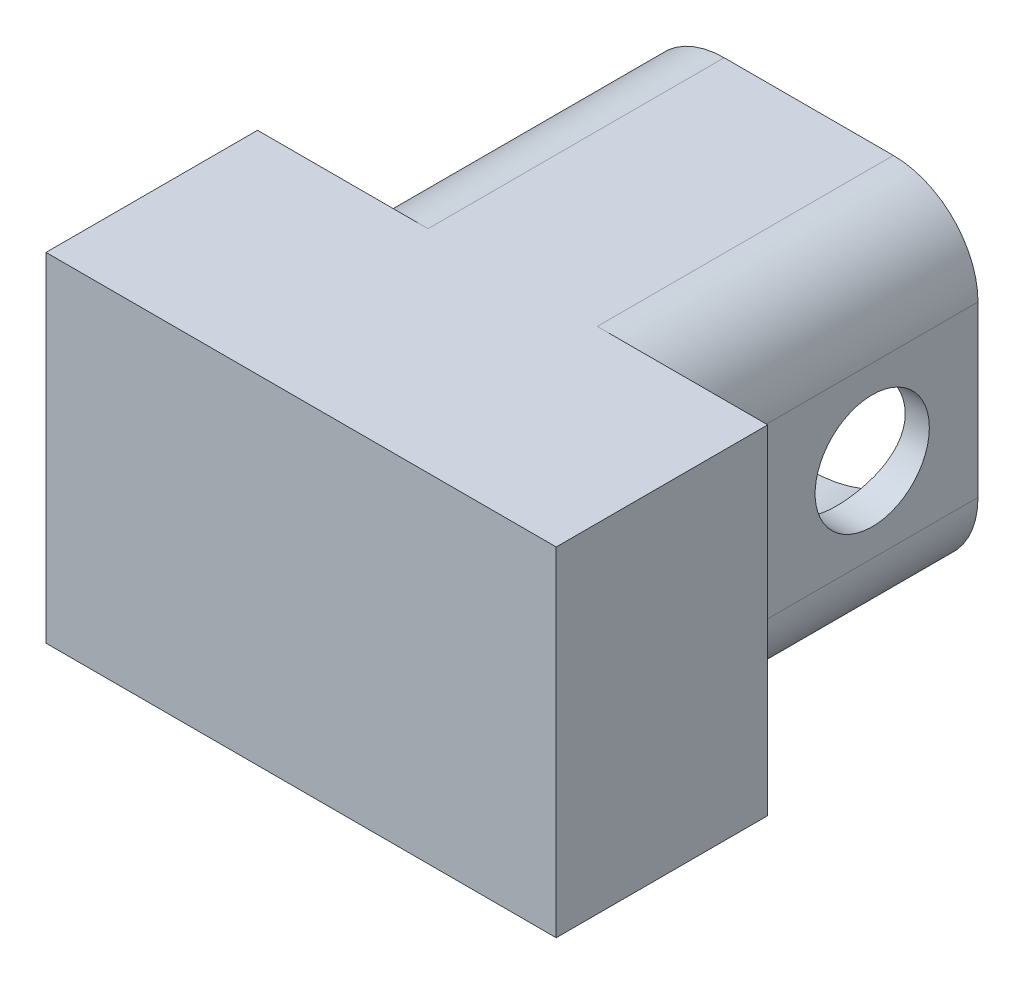
ISO-10303-21;
HEADER;
FILE_DESCRIPTION(('STEP AP214'),'2;1');
FILE_NAME('part.step','',(''),(''),'','','');
FILE_SCHEMA(('AUTOMOTIVE_DESIGN { 1 0 10303 214 1 1 1 1 }'));
ENDSEC;
DATA;
#1=APPLICATION_CONTEXT('core data for automotive mechanical design processes');
#2=APPLICATION_PROTOCOL_DEFINITION('international standard','automotive_design',2000,#1);
#3=PRODUCT_CONTEXT('',#1,'mechanical');
#4=PRODUCT('Part','Part','',(#3));
#5=PRODUCT_RELATED_PRODUCT_CATEGORY('part','',(#4));
#6=PRODUCT_DEFINITION_FORMATION('','',#4);
#7=PRODUCT_DEFINITION_CONTEXT('part definition',#1,'design');
#8=PRODUCT_DEFINITION('design','',#6,#7);
#9=PRODUCT_DEFINITION_SHAPE('','',#8);
#10=(LENGTH_UNIT() NAMED_UNIT(*) SI_UNIT(.MILLI.,.METRE.));
#11=(NAMED_UNIT(*) PLANE_ANGLE_UNIT() SI_UNIT($,.RADIAN.));
#12=(NAMED_UNIT(*) SI_UNIT($,.STERADIAN.) SOLID_ANGLE_UNIT());
#13=UNCERTAINTY_MEASURE_WITH_UNIT(LENGTH_MEASURE(1.E-05),#10,'distance_accuracy_value','');
#14=(GEOMETRIC_REPRESENTATION_CONTEXT(3) GLOBAL_UNCERTAINTY_ASSIGNED_CONTEXT((#13)) GLOBAL_UNIT_ASSIGNED_CONTEXT((#10,
#11,#12)) REPRESENTATION_CONTEXT('',''));
#15=CARTESIAN_POINT('',(0.,0.,0.));
#16=DIRECTION('',(0.,0.,1.));
#17=DIRECTION('',(1.,0.,0.));
#18=AXIS2_PLACEMENT_3D('',#15,#16,#17);
#19=CARTESIAN_POINT('',(0.,0.,0.));
#20=DIRECTION('',(0.,0.,1.));
#21=DIRECTION('',(1.,0.,0.));
#22=AXIS2_PLACEMENT_3D('',#19,#20,#21);
#23=PLANE('',#22);
#24=DIRECTION('',(-1.,0.,0.));
#25=VECTOR('',#24,1.);
#26=CARTESIAN_POINT('',(4.,-4.,0.));
#27=LINE('',#26,#25);
#28=CARTESIAN_POINT('',(2.,-4.,0.));
#29=VERTEX_POINT('',#28);
#30=CARTESIAN_POINT('',(-2.,-4.,0.));
#31=VERTEX_POINT('',#30);
#32=EDGE_CURVE('E207',#29,#31,#27,.T.);
#33=ORIENTED_EDGE('',*,*,#32,.T.);
#34=CARTESIAN_POINT('',(-2.,-2.,0.));
#35=DIRECTION('',(0.,0.,1.));
#36=DIRECTION('',(1.,0.,0.));
#37=AXIS2_PLACEMENT_3D('',#34,#35,#36);
#38=CIRCLE('',#37,2.);
#39=CARTESIAN_POINT('',(-4.,-2.,0.));
#40=VERTEX_POINT('',#39);
#41=EDGE_CURVE('E229',#31,#40,#38,.F.);
#42=ORIENTED_EDGE('',*,*,#41,.T.);
#43=DIRECTION('',(0.,1.,0.));
#44=VECTOR('',#43,1.);
#45=CARTESIAN_POINT('',(-4.,-4.,0.));
#46=LINE('',#45,#44);
#47=CARTESIAN_POINT('',(-4.,2.,0.));
#48=VERTEX_POINT('',#47);
#49=EDGE_CURVE('E313',#40,#48,#46,.T.);
#50=ORIENTED_EDGE('',*,*,#49,.T.);
#51=CARTESIAN_POINT('',(-2.,2.,0.));
#52=DIRECTION('',(0.,0.,1.));
#53=DIRECTION('',(1.,0.,0.));
#54=AXIS2_PLACEMENT_3D('',#51,#52,#53);
#55=CIRCLE('',#54,2.);
#56=CARTESIAN_POINT('',(-2.,4.,0.));
#57=VERTEX_POINT('',#56);
#58=EDGE_CURVE('E240',#48,#57,#55,.F.);
#59=ORIENTED_EDGE('',*,*,#58,.T.);
#60=DIRECTION('',(-1.,0.,0.));
#61=VECTOR('',#60,1.);
#62=CARTESIAN_POINT('',(4.,4.,0.));
#63=LINE('',#62,#61);
#64=CARTESIAN_POINT('',(2.,4.,0.));
#65=VERTEX_POINT('',#64);
#66=EDGE_CURVE('E354',#65,#57,#63,.T.);
#67=ORIENTED_EDGE('',*,*,#66,.F.);
#68=CARTESIAN_POINT('',(2.,2.,0.));
#69=DIRECTION('',(0.,0.,1.));
#70=DIRECTION('',(1.,0.,0.));
#71=AXIS2_PLACEMENT_3D('',#68,#69,#70);
#72=CIRCLE('',#71,2.);
#73=CARTESIAN_POINT('',(4.,2.,0.));
#74=VERTEX_POINT('',#73);
#75=EDGE_CURVE('E182',#65,#74,#72,.F.);
#76=ORIENTED_EDGE('',*,*,#75,.T.);
#77=DIRECTION('',(0.,1.,0.));
#78=VECTOR('',#77,1.);
#79=CARTESIAN_POINT('',(4.,-4.,0.));
#80=LINE('',#79,#78);
#81=CARTESIAN_POINT('',(4.,-2.,0.));
#82=VERTEX_POINT('',#81);
#83=EDGE_CURVE('E223',#82,#74,#80,.T.);
#84=ORIENTED_EDGE('',*,*,#83,.F.);
#85=CARTESIAN_POINT('',(2.,-2.,0.));
#86=DIRECTION('',(0.,0.,1.));
#87=DIRECTION('',(1.,0.,0.));
#88=AXIS2_PLACEMENT_3D('',#85,#86,#87);
#89=CIRCLE('',#88,2.);
#90=EDGE_CURVE('E210',#82,#29,#89,.F.);
#91=ORIENTED_EDGE('',*,*,#90,.T.);
#92=EDGE_LOOP('',(#33,#42,#50,#59,#67,#76,#84,#91));
#93=FACE_BOUND('',#92,.T.);
#94=CARTESIAN_POINT('',(0.,0.,0.));
#95=DIRECTION('',(0.,0.,1.));
#96=DIRECTION('',(1.,0.,0.));
#97=AXIS2_PLACEMENT_3D('',#94,#95,#96);
#98=CIRCLE('',#97,3.43);
#99=CARTESIAN_POINT('',(3.43,0.,0.));
#100=VERTEX_POINT('',#99);
#101=EDGE_CURVE('E219',#100,#100,#98,.T.);
#102=ORIENTED_EDGE('',*,*,#101,.T.);
#103=EDGE_LOOP('',(#102));
#104=FACE_BOUND('',#103,.T.);
#105=ADVANCED_FACE('F34',(#93,#104),#23,.F.);
#106=CARTESIAN_POINT('',(4.,-4.,7.));
#107=DIRECTION('',(-1.,0.,0.));
#108=DIRECTION('',(0.,0.,1.));
#109=AXIS2_PLACEMENT_3D('',#106,#107,#108);
#110=PLANE('',#109);
#111=CARTESIAN_POINT('',(4.,0.,2.5));
#112=DIRECTION('',(1.,0.,0.));
#113=DIRECTION('',(0.,0.,-1.));
#114=AXIS2_PLACEMENT_3D('',#111,#112,#113);
#115=CIRCLE('',#114,1.35);
#116=CARTESIAN_POINT('',(4.,0.,1.15));
#117=VERTEX_POINT('',#116);
#118=EDGE_CURVE('E147',#117,#117,#115,.T.);
#119=ORIENTED_EDGE('',*,*,#118,.F.);
#120=EDGE_LOOP('',(#119));
#121=FACE_BOUND('',#120,.T.);
#122=DIRECTION('',(0.,1.,0.));
#123=VECTOR('',#122,1.);
#124=CARTESIAN_POINT('',(4.,-4.,7.));
#125=LINE('',#124,#123);
#126=CARTESIAN_POINT('',(4.,-2.,7.));
#127=VERTEX_POINT('',#126);
#128=CARTESIAN_POINT('',(4.,2.,7.));
#129=VERTEX_POINT('',#128);
#130=EDGE_CURVE('E176',#127,#129,#125,.T.);
#131=ORIENTED_EDGE('',*,*,#130,.F.);
#132=DIRECTION('',(0.,0.,-1.));
#133=VECTOR('',#132,1.);
#134=CARTESIAN_POINT('',(4.,-2.,0.));
#135=LINE('',#134,#133);
#136=EDGE_CURVE('E190',#127,#82,#135,.T.);
#137=ORIENTED_EDGE('',*,*,#136,.T.);
#138=ORIENTED_EDGE('',*,*,#83,.T.);
#139=DIRECTION('',(0.,0.,-1.));
#140=VECTOR('',#139,1.);
#141=CARTESIAN_POINT('',(4.,2.,7.));
#142=LINE('',#141,#140);
#143=EDGE_CURVE('E205',#74,#129,#142,.F.);
#144=ORIENTED_EDGE('',*,*,#143,.T.);
#145=EDGE_LOOP('',(#131,#137,#138,#144));
#146=FACE_BOUND('',#145,.T.);
#147=ADVANCED_FACE('F202',(#121,#146),#110,.F.);
#148=CARTESIAN_POINT('',(4.,4.,7.));
#149=DIRECTION('',(0.,-1.,0.));
#150=DIRECTION('',(1.,0.,0.));
#151=AXIS2_PLACEMENT_3D('',#148,#149,#150);
#152=PLANE('',#151);
#153=DIRECTION('',(-1.,0.,0.));
#154=VECTOR('',#153,1.);
#155=CARTESIAN_POINT('',(6.03,4.,7.));
#156=LINE('',#155,#154);
#157=CARTESIAN_POINT('',(6.03,4.,7.));
#158=VERTEX_POINT('',#157);
#159=CARTESIAN_POINT('',(2.,4.,7.));
#160=VERTEX_POINT('',#159);
#161=EDGE_CURVE('E49',#158,#160,#156,.T.);
#162=ORIENTED_EDGE('',*,*,#161,.T.);
#163=DIRECTION('',(0.,0.,-1.));
#164=VECTOR('',#163,1.);
#165=CARTESIAN_POINT('',(2.,4.,7.));
#166=LINE('',#165,#164);
#167=EDGE_CURVE('E180',#160,#65,#166,.T.);
#168=ORIENTED_EDGE('',*,*,#167,.T.);
#169=ORIENTED_EDGE('',*,*,#66,.T.);
#170=DIRECTION('',(0.,0.,-1.));
#171=VECTOR('',#170,1.);
#172=CARTESIAN_POINT('',(-2.,4.,7.));
#173=LINE('',#172,#171);
#174=CARTESIAN_POINT('',(-2.,4.,7.));
#175=VERTEX_POINT('',#174);
#176=EDGE_CURVE('E186',#57,#175,#173,.F.);
#177=ORIENTED_EDGE('',*,*,#176,.T.);
#178=CARTESIAN_POINT('',(-6.03,4.,7.));
#179=VERTEX_POINT('',#178);
#180=EDGE_CURVE('E56',#175,#179,#156,.T.);
#181=ORIENTED_EDGE('',*,*,#180,.T.);
#182=DIRECTION('',(0.,0.,-1.));
#183=VECTOR('',#182,1.);
#184=CARTESIAN_POINT('',(-6.03,4.,12.));
#185=LINE('',#184,#183);
#186=CARTESIAN_POINT('',(-6.03,4.,12.));
#187=VERTEX_POINT('',#186);
#188=EDGE_CURVE('E164',#187,#179,#185,.T.);
#189=ORIENTED_EDGE('',*,*,#188,.F.);
#190=DIRECTION('',(-1.,0.,0.));
#191=VECTOR('',#190,1.);
#192=CARTESIAN_POINT('',(6.03,4.,12.));
#193=LINE('',#192,#191);
#194=CARTESIAN_POINT('',(6.03,4.,12.));
#195=VERTEX_POINT('',#194);
#196=EDGE_CURVE('E140',#195,#187,#193,.T.);
#197=ORIENTED_EDGE('',*,*,#196,.F.);
#198=DIRECTION('',(0.,0.,-1.));
#199=VECTOR('',#198,1.);
#200=CARTESIAN_POINT('',(6.03,4.,12.));
#201=LINE('',#200,#199);
#202=EDGE_CURVE('E152',#195,#158,#201,.T.);
#203=ORIENTED_EDGE('',*,*,#202,.T.);
#204=EDGE_LOOP('',(#162,#168,#169,#177,#181,#189,#197,#203));
#205=FACE_BOUND('',#204,.T.);
#206=ADVANCED_FACE('F167',(#205),#152,.F.);
#207=CARTESIAN_POINT('',(-4.,-4.,7.));
#208=DIRECTION('',(-1.,0.,0.));
#209=DIRECTION('',(0.,0.,1.));
#210=AXIS2_PLACEMENT_3D('',#207,#208,#209);
#211=PLANE('',#210);
#212=CARTESIAN_POINT('',(-4.,0.,2.5));
#213=DIRECTION('',(-1.,0.,0.));
#214=DIRECTION('',(0.,0.,1.));
#215=AXIS2_PLACEMENT_3D('',#212,#213,#214);
#216=CIRCLE('',#215,1.35);
#217=CARTESIAN_POINT('',(-4.,0.,3.85));
#218=VERTEX_POINT('',#217);
#219=EDGE_CURVE('E255',#218,#218,#216,.T.);
#220=ORIENTED_EDGE('',*,*,#219,.F.);
#221=EDGE_LOOP('',(#220));
#222=FACE_BOUND('',#221,.T.);
#223=ORIENTED_EDGE('',*,*,#49,.F.);
#224=DIRECTION('',(0.,0.,-1.));
#225=VECTOR('',#224,1.);
#226=CARTESIAN_POINT('',(-4.,-2.,7.));
#227=LINE('',#226,#225);
#228=CARTESIAN_POINT('',(-4.,-2.,7.));
#229=VERTEX_POINT('',#228);
#230=EDGE_CURVE('E211',#40,#229,#227,.F.);
#231=ORIENTED_EDGE('',*,*,#230,.T.);
#232=DIRECTION('',(0.,1.,0.));
#233=VECTOR('',#232,1.);
#234=CARTESIAN_POINT('',(-4.,-4.,7.));
#235=LINE('',#234,#233);
#236=CARTESIAN_POINT('',(-4.,2.,7.));
#237=VERTEX_POINT('',#236);
#238=EDGE_CURVE('E206',#229,#237,#235,.T.);
#239=ORIENTED_EDGE('',*,*,#238,.T.);
#240=DIRECTION('',(0.,0.,-1.));
#241=VECTOR('',#240,1.);
#242=CARTESIAN_POINT('',(-4.,2.,0.));
#243=LINE('',#242,#241);
#244=EDGE_CURVE('E231',#237,#48,#243,.T.);
#245=ORIENTED_EDGE('',*,*,#244,.T.);
#246=EDGE_LOOP('',(#223,#231,#239,#245));
#247=FACE_BOUND('',#246,.T.);
#248=ADVANCED_FACE('F289',(#222,#247),#211,.T.);
#249=CARTESIAN_POINT('',(4.,-4.,7.));
#250=DIRECTION('',(0.,-1.,0.));
#251=DIRECTION('',(1.,0.,0.));
#252=AXIS2_PLACEMENT_3D('',#249,#250,#251);
#253=PLANE('',#252);
#254=DIRECTION('',(1.,0.,0.));
#255=VECTOR('',#254,1.);
#256=CARTESIAN_POINT('',(6.03,-4.,7.));
#257=LINE('',#256,#255);
#258=CARTESIAN_POINT('',(-6.03,-4.,7.));
#259=VERTEX_POINT('',#258);
#260=CARTESIAN_POINT('',(-2.,-4.,7.));
#261=VERTEX_POINT('',#260);
#262=EDGE_CURVE('E315',#259,#261,#257,.T.);
#263=ORIENTED_EDGE('',*,*,#262,.T.);
#264=DIRECTION('',(0.,0.,-1.));
#265=VECTOR('',#264,1.);
#266=CARTESIAN_POINT('',(-2.,-4.,7.));
#267=LINE('',#266,#265);
#268=EDGE_CURVE('E244',#261,#31,#267,.T.);
#269=ORIENTED_EDGE('',*,*,#268,.T.);
#270=ORIENTED_EDGE('',*,*,#32,.F.);
#271=DIRECTION('',(0.,0.,-1.));
#272=VECTOR('',#271,1.);
#273=CARTESIAN_POINT('',(2.,-4.,7.));
#274=LINE('',#273,#272);
#275=CARTESIAN_POINT('',(2.,-4.,7.));
#276=VERTEX_POINT('',#275);
#277=EDGE_CURVE('E228',#29,#276,#274,.F.);
#278=ORIENTED_EDGE('',*,*,#277,.T.);
#279=CARTESIAN_POINT('',(6.03,-4.,7.));
#280=VERTEX_POINT('',#279);
#281=EDGE_CURVE('E195',#276,#280,#257,.T.);
#282=ORIENTED_EDGE('',*,*,#281,.T.);
#283=DIRECTION('',(0.,0.,-1.));
#284=VECTOR('',#283,1.);
#285=CARTESIAN_POINT('',(6.03,-4.,12.));
#286=LINE('',#285,#284);
#287=CARTESIAN_POINT('',(6.03,-4.,12.));
#288=VERTEX_POINT('',#287);
#289=EDGE_CURVE('E131',#288,#280,#286,.T.);
#290=ORIENTED_EDGE('',*,*,#289,.F.);
#291=DIRECTION('',(1.,0.,0.));
#292=VECTOR('',#291,1.);
#293=CARTESIAN_POINT('',(6.03,-4.,12.));
#294=LINE('',#293,#292);
#295=CARTESIAN_POINT('',(-6.03,-4.,12.));
#296=VERTEX_POINT('',#295);
#297=EDGE_CURVE('E124',#296,#288,#294,.T.);
#298=ORIENTED_EDGE('',*,*,#297,.F.);
#299=DIRECTION('',(0.,0.,-1.));
#300=VECTOR('',#299,1.);
#301=CARTESIAN_POINT('',(-6.03,-4.,12.));
#302=LINE('',#301,#300);
#303=EDGE_CURVE('E128',#296,#259,#302,.T.);
#304=ORIENTED_EDGE('',*,*,#303,.T.);
#305=EDGE_LOOP('',(#263,#269,#270,#278,#282,#290,#298,#304));
#306=FACE_BOUND('',#305,.T.);
#307=ADVANCED_FACE('F126',(#306),#253,.T.);
#308=CARTESIAN_POINT('',(0.,0.,6.));
#309=DIRECTION('',(0.,0.,-1.));
#310=DIRECTION('',(-1.,0.,0.));
#311=AXIS2_PLACEMENT_3D('',#308,#309,#310);
#312=CYLINDRICAL_SURFACE('',#311,3.43);
#313=CARTESIAN_POINT('',(-3.43,0.,3.85));
#314=CARTESIAN_POINT('',(-3.42999461867466,-0.0726691182774942,3.84999259309495));
#315=CARTESIAN_POINT('',(-3.42766400164212,-0.145447312396492,3.84409905425139));
#316=CARTESIAN_POINT('',(-3.41856831393283,-0.288952529132376,3.82072680978598));
#317=CARTESIAN_POINT('',(-3.41179191570856,-0.359673828931423,3.80321850926845));
#318=CARTESIAN_POINT('',(-3.39453674778715,-0.496766583296369,3.75734976535437));
#319=CARTESIAN_POINT('',(-3.38406967210994,-0.563151000929101,3.72902357546589));
#320=CARTESIAN_POINT('',(-3.36046765154247,-0.690171098961408,3.66245791337116));
#321=CARTESIAN_POINT('',(-3.34733352245565,-0.750808528961646,3.62422147154585));
#322=CARTESIAN_POINT('',(-3.31905714947214,-0.867474998141879,3.53706686520674));
#323=CARTESIAN_POINT('',(-3.30385392699048,-0.923205587481664,3.48776911274514));
#324=CARTESIAN_POINT('',(-3.27343650157305,-1.02585845035394,3.3806926554875));
#325=CARTESIAN_POINT('',(-3.25822229680117,-1.07277666646124,3.32291006578114));
#326=CARTESIAN_POINT('',(-3.2287830922689,-1.15844834318152,3.1974993611374));
#327=CARTESIAN_POINT('',(-3.21462826714246,-1.19676658276798,3.12955577745696));
#328=CARTESIAN_POINT('',(-3.18986369608175,-1.26129824313533,2.98754641920018));
#329=CARTESIAN_POINT('',(-3.17925233249198,-1.28751718956027,2.91348345754891));
#330=CARTESIAN_POINT('',(-3.16342921281114,-1.32590800852618,2.76476497524941));
#331=CARTESIAN_POINT('',(-3.15799929319833,-1.33865014836824,2.69028070902979));
#332=CARTESIAN_POINT('',(-3.15251982669444,-1.35150754824921,2.54004856151097));
#333=CARTESIAN_POINT('',(-3.15246774545233,-1.35162875600753,2.46430129224554));
#334=CARTESIAN_POINT('',(-3.15756319203003,-1.33967405873048,2.31910261939723));
#335=CARTESIAN_POINT('',(-3.16236258809315,-1.3284147967796,2.24956941617616));
#336=CARTESIAN_POINT('',(-3.1760374186897,-1.29537737604351,2.11347325833907));
#337=CARTESIAN_POINT('',(-3.18491353988524,-1.27359744518022,2.04691080617379));
#338=CARTESIAN_POINT('',(-3.20593399859639,-1.21972721450417,1.91707076796523));
#339=CARTESIAN_POINT('',(-3.21814028228068,-1.18743899062582,1.85388577447715));
#340=CARTESIAN_POINT('',(-3.24442774907871,-1.11360738829165,1.73360384860275));
#341=CARTESIAN_POINT('',(-3.25850962123978,-1.07206060466362,1.67650916760388));
#342=CARTESIAN_POINT('',(-3.28824214724732,-0.977244971484314,1.56554487631282));
#343=CARTESIAN_POINT('',(-3.30393144751812,-0.923332695973701,1.5122339681562));
#344=CARTESIAN_POINT('',(-3.33421492974229,-0.807162225398411,1.41523440908283));
#345=CARTESIAN_POINT('',(-3.34880890687259,-0.744902475409229,1.3715475549022));
#346=CARTESIAN_POINT('',(-3.37560234922155,-0.612261684597452,1.29433434560813));
#347=CARTESIAN_POINT('',(-3.38775229002867,-0.541751250595059,1.26101183913964));
#348=CARTESIAN_POINT('',(-3.40791621167952,-0.395526524995113,1.20689211637504));
#349=CARTESIAN_POINT('',(-3.4159322240217,-0.319814810184563,1.18608874707395));
#350=CARTESIAN_POINT('',(-3.42655830686419,-0.170024854204709,1.15871307697103));
#351=CARTESIAN_POINT('',(-3.42945336553016,-0.0961040364780771,1.15138955621822));
#352=CARTESIAN_POINT('',(-3.43040459655297,0.0519594736526745,1.14897134582755));
#353=CARTESIAN_POINT('',(-3.42846197428817,0.126102106190727,1.15387360995849));
#354=CARTESIAN_POINT('',(-3.42014313177614,0.269141358817323,1.17521036248535));
#355=CARTESIAN_POINT('',(-3.41396207117091,0.338126237988831,1.19113750269105));
#356=CARTESIAN_POINT('',(-3.39798859243504,0.472384809445665,1.23338742607333));
#357=CARTESIAN_POINT('',(-3.38819570832586,0.537658021616487,1.2597115506454));
#358=CARTESIAN_POINT('',(-3.36558403842615,0.664865596422934,1.32286388322368));
#359=CARTESIAN_POINT('',(-3.35268248230786,0.726638636466474,1.35998647633805));
#360=CARTESIAN_POINT('',(-3.32525982786698,0.843293370557398,1.44335390129011));
#361=CARTESIAN_POINT('',(-3.31073809339974,0.898172339618932,1.48960232179718));
#362=CARTESIAN_POINT('',(-3.28050972685944,1.00315978517192,1.59337996861441));
#363=CARTESIAN_POINT('',(-3.26478670516577,1.05273881757062,1.65144143654552));
#364=CARTESIAN_POINT('',(-3.23479747245334,1.14157326617891,1.77534704584264));
#365=CARTESIAN_POINT('',(-3.22053147030175,1.18082720352902,1.84119230012197));
#366=CARTESIAN_POINT('',(-3.19507292578562,1.24808622152813,1.97966398501648));
#367=CARTESIAN_POINT('',(-3.18390628842723,1.27599734489246,2.05234115095503));
#368=CARTESIAN_POINT('',(-3.16634614139655,1.31897742617913,2.20193373176816));
#369=CARTESIAN_POINT('',(-3.15994926356162,1.33405544725479,2.27884611465514));
#370=CARTESIAN_POINT('',(-3.15312990950876,1.35008910988525,2.42892526676529));
#371=CARTESIAN_POINT('',(-3.15232060651769,1.35195934905278,2.5019774089218));
#372=CARTESIAN_POINT('',(-3.15576023996586,1.34391083221688,2.64730074137794));
#373=CARTESIAN_POINT('',(-3.16000858149335,1.33399346274586,2.71957202251839));
#374=CARTESIAN_POINT('',(-3.17274849766893,1.30338946943694,2.85854398466298));
#375=CARTESIAN_POINT('',(-3.18107697665835,1.28311559172533,2.92535185188826));
#376=CARTESIAN_POINT('',(-3.20092890531337,1.2327542225459,3.05464767833826));
#377=CARTESIAN_POINT('',(-3.21245319821345,1.20266414064418,3.11713449198326));
#378=CARTESIAN_POINT('',(-3.2382007811331,1.13157385286638,3.23982829071314));
#379=CARTESIAN_POINT('',(-3.25253913812091,1.09005670350219,3.2997112293429));
#380=CARTESIAN_POINT('',(-3.28193778010447,0.998055219571338,3.41195129544823));
#381=CARTESIAN_POINT('',(-3.29699831560464,0.947567756772763,3.46430578595444));
#382=CARTESIAN_POINT('',(-3.32726679350281,0.835329731057404,3.56332747262566));
#383=CARTESIAN_POINT('',(-3.34242588135929,0.773074636116301,3.60944009043098));
#384=CARTESIAN_POINT('',(-3.37021708000253,0.641147577831644,3.69055458956778));
#385=CARTESIAN_POINT('',(-3.38284885347425,0.571474626342043,3.72555498814139));
#386=CARTESIAN_POINT('',(-3.4032459880961,0.43279331961214,3.78073483741147));
#387=CARTESIAN_POINT('',(-3.41133365710132,0.364231562222375,3.8019209538476));
#388=CARTESIAN_POINT('',(-3.42336679150098,0.224385414752733,3.83313695462557));
#389=CARTESIAN_POINT('',(-3.42732364250881,0.153109072571589,3.84319750849202));
#390=CARTESIAN_POINT('',(-3.42967818481395,0.0543912841734435,3.84918069940821));
#391=CARTESIAN_POINT('',(-3.43000201446954,0.0272032846930257,3.85000277273416));
#392=CARTESIAN_POINT('',(-3.43,0.,3.85));
#393=B_SPLINE_CURVE_WITH_KNOTS('',3,(#313,#314,#315,#316,#317,#318,#319,#320,#321,#322,#323,
#324,#325,#326,#327,#328,#329,#330,#331,#332,#333,#334,#335,#336,#337,#338,#339,#340,#341,#342,
#343,#344,#345,#346,#347,#348,#349,#350,#351,#352,#353,#354,#355,#356,#357,#358,#359,#360,#361,
#362,#363,#364,#365,#366,#367,#368,#369,#370,#371,#372,#373,#374,#375,#376,#377,#378,#379,#380,
#381,#382,#383,#384,#385,#386,#387,#388,#389,#390,#391,#392),.UNSPECIFIED.,.T.,.F.,(4,2,2,2,2,2,
2,2,2,2,2,2,2,2,2,2,2,2,2,2,2,2,2,2,2,2,2,2,2,2,2,2,2,2,2,2,2,2,2,4),(0.,0.217926796673844,
0.436411023739172,0.654209107595914,0.871940671036631,1.09877051041955,1.32570453297856,
1.56234803073253,1.79888334820339,2.02495152166391,2.25091315813152,2.46173572429921,
2.67259381334025,2.88767864081601,3.10284270450285,3.33406480050383,3.56533002736004,
3.80089187076459,4.03633784360556,4.2582115635739,4.48003000601818,4.69226575629962,
4.90452889770864,5.12323026745045,5.34201781202764,5.57479566805454,5.80760684663349,
6.04230900790883,6.27684527703592,6.49496569924976,6.71306046731138,6.92307232834853,
7.13313965507331,7.35498019959905,7.57689825932702,7.8125882716601,8.04830972006175,
8.26400114104489,8.47909647779845,8.56067617537397),.UNSPECIFIED.);
#394=CARTESIAN_POINT('',(-3.43,0.,3.85));
#395=VERTEX_POINT('',#394);
#396=EDGE_CURVE('E248',#395,#395,#393,.T.);
#397=ORIENTED_EDGE('',*,*,#396,.F.);
#398=EDGE_LOOP('',(#397));
#399=FACE_BOUND('',#398,.T.);
#400=CARTESIAN_POINT('',(3.43,0.,1.15));
#401=CARTESIAN_POINT('',(3.42999461867466,-0.0726691182774942,1.15000740690505));
#402=CARTESIAN_POINT('',(3.42766400164212,-0.145447312396492,1.15590094574861));
#403=CARTESIAN_POINT('',(3.41856831393283,-0.288952529132376,1.17927319021402));
#404=CARTESIAN_POINT('',(3.41179191570856,-0.359673828931423,1.19678149073155));
#405=CARTESIAN_POINT('',(3.39453674778715,-0.496766583296369,1.24265023464563));
#406=CARTESIAN_POINT('',(3.38406967210994,-0.563151000929101,1.27097642453411));
#407=CARTESIAN_POINT('',(3.36046765154247,-0.690171098961408,1.33754208662884));
#408=CARTESIAN_POINT('',(3.34733352245565,-0.750808528961646,1.37577852845415));
#409=CARTESIAN_POINT('',(3.31905714947214,-0.867474998141879,1.46293313479326));
#410=CARTESIAN_POINT('',(3.30385392699048,-0.923205587481664,1.51223088725486));
#411=CARTESIAN_POINT('',(3.27343650157305,-1.02585845035394,1.6193073445125));
#412=CARTESIAN_POINT('',(3.25822229680117,-1.07277666646124,1.67708993421886));
#413=CARTESIAN_POINT('',(3.2287830922689,-1.15844834318153,1.8025006388626));
#414=CARTESIAN_POINT('',(3.21462826714246,-1.19676658276798,1.87044422254304));
#415=CARTESIAN_POINT('',(3.18986369608175,-1.26129824313533,2.01245358079982));
#416=CARTESIAN_POINT('',(3.17925233249198,-1.28751718956027,2.08651654245109));
#417=CARTESIAN_POINT('',(3.16342921281114,-1.32590800852618,2.23523502475059));
#418=CARTESIAN_POINT('',(3.15799929319833,-1.33865014836824,2.30971929097021));
#419=CARTESIAN_POINT('',(3.15251982669444,-1.35150754824921,2.45995143848903));
#420=CARTESIAN_POINT('',(3.15246774545233,-1.35162875600753,2.53569870775446));
#421=CARTESIAN_POINT('',(3.15756319203003,-1.33967405873048,2.68089738060277));
#422=CARTESIAN_POINT('',(3.16236258809315,-1.3284147967796,2.75043058382384));
#423=CARTESIAN_POINT('',(3.1760374186897,-1.29537737604351,2.88652674166093));
#424=CARTESIAN_POINT('',(3.18491353988524,-1.27359744518022,2.95308919382621));
#425=CARTESIAN_POINT('',(3.20593399859639,-1.21972721450417,3.08292923203477));
#426=CARTESIAN_POINT('',(3.21814028228068,-1.18743899062582,3.14611422552285));
#427=CARTESIAN_POINT('',(3.24442774907871,-1.11360738829165,3.26639615139725));
#428=CARTESIAN_POINT('',(3.25850962123978,-1.07206060466362,3.32349083239612));
#429=CARTESIAN_POINT('',(3.28824214724732,-0.977244971484314,3.43445512368718));
#430=CARTESIAN_POINT('',(3.30393144751812,-0.923332695973701,3.4877660318438));
#431=CARTESIAN_POINT('',(3.33421492974229,-0.807162225398411,3.58476559091717));
#432=CARTESIAN_POINT('',(3.34880890687259,-0.74490247540923,3.6284524450978));
#433=CARTESIAN_POINT('',(3.37560234922155,-0.612261684597452,3.70566565439187));
#434=CARTESIAN_POINT('',(3.38775229002867,-0.541751250595059,3.73898816086036));
#435=CARTESIAN_POINT('',(3.40791621167952,-0.395526524995113,3.79310788362496));
#436=CARTESIAN_POINT('',(3.4159322240217,-0.319814810184563,3.81391125292605));
#437=CARTESIAN_POINT('',(3.42655830686419,-0.170024854204709,3.84128692302897));
#438=CARTESIAN_POINT('',(3.42945336553016,-0.0961040364780769,3.84861044378178));
#439=CARTESIAN_POINT('',(3.43040459655297,0.0519594736526747,3.85102865417245));
#440=CARTESIAN_POINT('',(3.42846197428817,0.126102106190728,3.84612639004151));
#441=CARTESIAN_POINT('',(3.42014313177614,0.269141358817323,3.82478963751465));
#442=CARTESIAN_POINT('',(3.41396207117091,0.338126237988832,3.80886249730895));
#443=CARTESIAN_POINT('',(3.39798859243504,0.472384809445665,3.76661257392667));
#444=CARTESIAN_POINT('',(3.38819570832586,0.537658021616487,3.7402884493546));
#445=CARTESIAN_POINT('',(3.36558403842615,0.664865596422934,3.67713611677632));
#446=CARTESIAN_POINT('',(3.35268248230786,0.726638636466474,3.64001352366195));
#447=CARTESIAN_POINT('',(3.32525982786698,0.843293370557398,3.55664609870989));
#448=CARTESIAN_POINT('',(3.31073809339974,0.898172339618933,3.51039767820282));
#449=CARTESIAN_POINT('',(3.28050972685944,1.00315978517193,3.40662003138559));
#450=CARTESIAN_POINT('',(3.26478670516577,1.05273881757062,3.34855856345448));
#451=CARTESIAN_POINT('',(3.23479747245334,1.14157326617891,3.22465295415736));
#452=CARTESIAN_POINT('',(3.22053147030175,1.18082720352902,3.15880769987803));
#453=CARTESIAN_POINT('',(3.19507292578562,1.24808622152813,3.02033601498352));
#454=CARTESIAN_POINT('',(3.18390628842723,1.27599734489246,2.94765884904497));
#455=CARTESIAN_POINT('',(3.16634614139655,1.31897742617914,2.79806626823184));
#456=CARTESIAN_POINT('',(3.15994926356162,1.33405544725479,2.72115388534486));
#457=CARTESIAN_POINT('',(3.15312990950876,1.35008910988525,2.57107473323471));
#458=CARTESIAN_POINT('',(3.15232060651769,1.35195934905278,2.4980225910782));
#459=CARTESIAN_POINT('',(3.15576023996586,1.34391083221688,2.35269925862206));
#460=CARTESIAN_POINT('',(3.16000858149335,1.33399346274586,2.28042797748161));
#461=CARTESIAN_POINT('',(3.17274849766893,1.30338946943694,2.14145601533702));
#462=CARTESIAN_POINT('',(3.18107697665835,1.28311559172533,2.07464814811174));
#463=CARTESIAN_POINT('',(3.20092890531337,1.2327542225459,1.94535232166174));
#464=CARTESIAN_POINT('',(3.21245319821345,1.20266414064418,1.88286550801674));
#465=CARTESIAN_POINT('',(3.2382007811331,1.13157385286638,1.76017170928686));
#466=CARTESIAN_POINT('',(3.25253913812091,1.09005670350219,1.7002887706571));
#467=CARTESIAN_POINT('',(3.28193778010447,0.998055219571339,1.58804870455177));
#468=CARTESIAN_POINT('',(3.29699831560464,0.947567756772763,1.53569421404556));
#469=CARTESIAN_POINT('',(3.32726679350281,0.835329731057404,1.43667252737434));
#470=CARTESIAN_POINT('',(3.34242588135929,0.773074636116302,1.39055990956902));
#471=CARTESIAN_POINT('',(3.37021708000253,0.641147577831645,1.30944541043222));
#472=CARTESIAN_POINT('',(3.38284885347425,0.571474626342044,1.27444501185861));
#473=CARTESIAN_POINT('',(3.4032459880961,0.432793319612141,1.21926516258853));
#474=CARTESIAN_POINT('',(3.41133365710132,0.364231562222377,1.1980790461524));
#475=CARTESIAN_POINT('',(3.42336679150098,0.224385414752735,1.16686304537443));
#476=CARTESIAN_POINT('',(3.42732364250881,0.15310907257159,1.15680249150798));
#477=CARTESIAN_POINT('',(3.42967818481395,0.0543912841734438,1.15081930059179));
#478=CARTESIAN_POINT('',(3.43000201446954,0.0272032846930258,1.14999722726584));
#479=CARTESIAN_POINT('',(3.43,0.,1.15));
#480=B_SPLINE_CURVE_WITH_KNOTS('',3,(#400,#401,#402,#403,#404,#405,#406,#407,#408,#409,#410,
#411,#412,#413,#414,#415,#416,#417,#418,#419,#420,#421,#422,#423,#424,#425,#426,#427,#428,#429,
#430,#431,#432,#433,#434,#435,#436,#437,#438,#439,#440,#441,#442,#443,#444,#445,#446,#447,#448,
#449,#450,#451,#452,#453,#454,#455,#456,#457,#458,#459,#460,#461,#462,#463,#464,#465,#466,#467,
#468,#469,#470,#471,#472,#473,#474,#475,#476,#477,#478,#479),.UNSPECIFIED.,.T.,.F.,(4,2,2,2,2,2,
2,2,2,2,2,2,2,2,2,2,2,2,2,2,2,2,2,2,2,2,2,2,2,2,2,2,2,2,2,2,2,2,2,4),(0.,0.217926796673844,
0.436411023739172,0.654209107595914,0.871940671036631,1.09877051041955,1.32570453297856,
1.56234803073253,1.79888334820339,2.02495152166391,2.25091315813152,2.46173572429921,
2.67259381334025,2.88767864081601,3.10284270450285,3.33406480050383,3.56533002736004,
3.80089187076459,4.03633784360556,4.2582115635739,4.48003000601818,4.69226575629962,
4.90452889770864,5.12323026745045,5.34201781202764,5.57479566805454,5.80760684663349,
6.04230900790883,6.27684527703592,6.49496569924976,6.71306046731139,6.92307232834853,
7.13313965507331,7.35498019959905,7.57689825932702,7.8125882716601,8.04830972006175,
8.26400114104489,8.47909647779845,8.56067617537397),.UNSPECIFIED.);
#481=CARTESIAN_POINT('',(3.43,0.,1.15));
#482=VERTEX_POINT('',#481);
#483=EDGE_CURVE('E150',#482,#482,#480,.T.);
#484=ORIENTED_EDGE('',*,*,#483,.F.);
#485=EDGE_LOOP('',(#484));
#486=FACE_BOUND('',#485,.T.);
#487=CARTESIAN_POINT('',(0.,0.,6.));
#488=DIRECTION('',(0.,0.,1.));
#489=DIRECTION('',(1.,0.,0.));
#490=AXIS2_PLACEMENT_3D('',#487,#488,#489);
#491=CIRCLE('',#490,3.43);
#492=CARTESIAN_POINT('',(3.43,0.,6.));
#493=VERTEX_POINT('',#492);
#494=EDGE_CURVE('E350',#493,#493,#491,.T.);
#495=ORIENTED_EDGE('',*,*,#494,.T.);
#496=EDGE_LOOP('',(#495));
#497=FACE_BOUND('',#496,.T.);
#498=ORIENTED_EDGE('',*,*,#101,.F.);
#499=EDGE_LOOP('',(#498));
#500=FACE_BOUND('',#499,.T.);
#501=ADVANCED_FACE('F259',(#399,#486,#497,#500),#312,.F.);
#502=CARTESIAN_POINT('',(0.,0.,6.));
#503=DIRECTION('',(0.,0.,1.));
#504=DIRECTION('',(1.,0.,0.));
#505=AXIS2_PLACEMENT_3D('',#502,#503,#504);
#506=PLANE('',#505);
#507=ORIENTED_EDGE('',*,*,#494,.F.);
#508=EDGE_LOOP('',(#507));
#509=FACE_BOUND('',#508,.T.);
#510=ADVANCED_FACE('F268',(#509),#506,.F.);
#511=CARTESIAN_POINT('',(-8.6,0.,2.5));
#512=DIRECTION('',(1.,0.,0.));
#513=DIRECTION('',(0.,0.,-1.));
#514=AXIS2_PLACEMENT_3D('',#511,#512,#513);
#515=CYLINDRICAL_SURFACE('',#514,1.35);
#516=ORIENTED_EDGE('',*,*,#483,.T.);
#517=EDGE_LOOP('',(#516));
#518=FACE_BOUND('',#517,.T.);
#519=ORIENTED_EDGE('',*,*,#118,.T.);
#520=EDGE_LOOP('',(#519));
#521=FACE_BOUND('',#520,.T.);
#522=ADVANCED_FACE('F263',(#518,#521),#515,.F.);
#523=ORIENTED_EDGE('',*,*,#219,.T.);
#524=EDGE_LOOP('',(#523));
#525=FACE_BOUND('',#524,.T.);
#526=ORIENTED_EDGE('',*,*,#396,.T.);
#527=EDGE_LOOP('',(#526));
#528=FACE_BOUND('',#527,.T.);
#529=ADVANCED_FACE('F267',(#525,#528),#515,.F.);
#530=CARTESIAN_POINT('',(0.,0.,7.));
#531=DIRECTION('',(0.,0.,1.));
#532=DIRECTION('',(1.,0.,0.));
#533=AXIS2_PLACEMENT_3D('',#530,#531,#532);
#534=PLANE('',#533);
#535=ORIENTED_EDGE('',*,*,#281,.F.);
#536=CARTESIAN_POINT('',(2.,-2.,7.));
#537=DIRECTION('',(0.,0.,1.));
#538=DIRECTION('',(1.,0.,0.));
#539=AXIS2_PLACEMENT_3D('',#536,#537,#538);
#540=CIRCLE('',#539,2.);
#541=EDGE_CURVE('E179',#276,#127,#540,.T.);
#542=ORIENTED_EDGE('',*,*,#541,.T.);
#543=ORIENTED_EDGE('',*,*,#130,.T.);
#544=CARTESIAN_POINT('',(2.,2.,7.));
#545=DIRECTION('',(0.,0.,1.));
#546=DIRECTION('',(1.,0.,0.));
#547=AXIS2_PLACEMENT_3D('',#544,#545,#546);
#548=CIRCLE('',#547,2.);
#549=EDGE_CURVE('E42',#129,#160,#548,.T.);
#550=ORIENTED_EDGE('',*,*,#549,.T.);
#551=ORIENTED_EDGE('',*,*,#161,.F.);
#552=DIRECTION('',(0.,1.,0.));
#553=VECTOR('',#552,1.);
#554=CARTESIAN_POINT('',(6.03,-4.,7.));
#555=LINE('',#554,#553);
#556=EDGE_CURVE('E162',#280,#158,#555,.T.);
#557=ORIENTED_EDGE('',*,*,#556,.F.);
#558=EDGE_LOOP('',(#535,#542,#543,#550,#551,#557));
#559=FACE_BOUND('',#558,.T.);
#560=ADVANCED_FACE('F171',(#559),#534,.F.);
#561=CARTESIAN_POINT('',(-6.03,-4.,12.));
#562=DIRECTION('',(1.,0.,0.));
#563=DIRECTION('',(0.,0.,-1.));
#564=AXIS2_PLACEMENT_3D('',#561,#562,#563);
#565=PLANE('',#564);
#566=DIRECTION('',(0.,-1.,0.));
#567=VECTOR('',#566,1.);
#568=CARTESIAN_POINT('',(-6.03,-4.,7.));
#569=LINE('',#568,#567);
#570=EDGE_CURVE('E146',#179,#259,#569,.T.);
#571=ORIENTED_EDGE('',*,*,#570,.T.);
#572=ORIENTED_EDGE('',*,*,#303,.F.);
#573=DIRECTION('',(0.,-1.,0.));
#574=VECTOR('',#573,1.);
#575=CARTESIAN_POINT('',(-6.03,-4.,12.));
#576=LINE('',#575,#574);
#577=EDGE_CURVE('E135',#187,#296,#576,.T.);
#578=ORIENTED_EDGE('',*,*,#577,.F.);
#579=ORIENTED_EDGE('',*,*,#188,.T.);
#580=EDGE_LOOP('',(#571,#572,#578,#579));
#581=FACE_BOUND('',#580,.T.);
#582=ADVANCED_FACE('F145',(#581),#565,.F.);
#583=CARTESIAN_POINT('',(6.03,-4.,12.));
#584=DIRECTION('',(-1.,0.,0.));
#585=DIRECTION('',(0.,0.,1.));
#586=AXIS2_PLACEMENT_3D('',#583,#584,#585);
#587=PLANE('',#586);
#588=ORIENTED_EDGE('',*,*,#556,.T.);
#589=ORIENTED_EDGE('',*,*,#202,.F.);
#590=DIRECTION('',(0.,1.,0.));
#591=VECTOR('',#590,1.);
#592=CARTESIAN_POINT('',(6.03,-4.,12.));
#593=LINE('',#592,#591);
#594=EDGE_CURVE('E134',#288,#195,#593,.T.);
#595=ORIENTED_EDGE('',*,*,#594,.F.);
#596=ORIENTED_EDGE('',*,*,#289,.T.);
#597=EDGE_LOOP('',(#588,#589,#595,#596));
#598=FACE_BOUND('',#597,.T.);
#599=ADVANCED_FACE('F322',(#598),#587,.F.);
#600=CARTESIAN_POINT('',(0.,0.,12.));
#601=DIRECTION('',(0.,0.,1.));
#602=DIRECTION('',(1.,0.,0.));
#603=AXIS2_PLACEMENT_3D('',#600,#601,#602);
#604=PLANE('',#603);
#605=ORIENTED_EDGE('',*,*,#577,.T.);
#606=ORIENTED_EDGE('',*,*,#297,.T.);
#607=ORIENTED_EDGE('',*,*,#594,.T.);
#608=ORIENTED_EDGE('',*,*,#196,.T.);
#609=EDGE_LOOP('',(#605,#606,#607,#608));
#610=FACE_BOUND('',#609,.T.);
#611=ADVANCED_FACE('F138',(#610),#604,.T.);
#612=ORIENTED_EDGE('',*,*,#238,.F.);
#613=CARTESIAN_POINT('',(-2.,-2.,7.));
#614=DIRECTION('',(0.,0.,1.));
#615=DIRECTION('',(1.,0.,0.));
#616=AXIS2_PLACEMENT_3D('',#613,#614,#615);
#617=CIRCLE('',#616,2.);
#618=EDGE_CURVE('E185',#229,#261,#617,.T.);
#619=ORIENTED_EDGE('',*,*,#618,.T.);
#620=ORIENTED_EDGE('',*,*,#262,.F.);
#621=ORIENTED_EDGE('',*,*,#570,.F.);
#622=ORIENTED_EDGE('',*,*,#180,.F.);
#623=CARTESIAN_POINT('',(-2.,2.,7.));
#624=DIRECTION('',(0.,0.,1.));
#625=DIRECTION('',(1.,0.,0.));
#626=AXIS2_PLACEMENT_3D('',#623,#624,#625);
#627=CIRCLE('',#626,2.);
#628=EDGE_CURVE('E12',#175,#237,#627,.T.);
#629=ORIENTED_EDGE('',*,*,#628,.T.);
#630=EDGE_LOOP('',(#612,#619,#620,#621,#622,#629));
#631=FACE_BOUND('',#630,.T.);
#632=ADVANCED_FACE('F298',(#631),#534,.F.);
#633=CARTESIAN_POINT('',(-2.,-2.,7.));
#634=DIRECTION('',(0.,0.,-1.));
#635=DIRECTION('',(-1.,0.,0.));
#636=AXIS2_PLACEMENT_3D('',#633,#634,#635);
#637=CYLINDRICAL_SURFACE('',#636,2.);
#638=ORIENTED_EDGE('',*,*,#618,.F.);
#639=ORIENTED_EDGE('',*,*,#230,.F.);
#640=ORIENTED_EDGE('',*,*,#41,.F.);
#641=ORIENTED_EDGE('',*,*,#268,.F.);
#642=EDGE_LOOP('',(#638,#639,#640,#641));
#643=FACE_BOUND('',#642,.T.);
#644=ADVANCED_FACE('F295',(#643),#637,.T.);
#645=CARTESIAN_POINT('',(2.,-2.,7.));
#646=DIRECTION('',(0.,0.,1.));
#647=DIRECTION('',(1.,0.,0.));
#648=AXIS2_PLACEMENT_3D('',#645,#646,#647);
#649=CYLINDRICAL_SURFACE('',#648,2.);
#650=ORIENTED_EDGE('',*,*,#541,.F.);
#651=ORIENTED_EDGE('',*,*,#277,.F.);
#652=ORIENTED_EDGE('',*,*,#90,.F.);
#653=ORIENTED_EDGE('',*,*,#136,.F.);
#654=EDGE_LOOP('',(#650,#651,#652,#653));
#655=FACE_BOUND('',#654,.T.);
#656=ADVANCED_FACE('F209',(#655),#649,.T.);
#657=CARTESIAN_POINT('',(2.,2.,7.));
#658=DIRECTION('',(0.,0.,-1.));
#659=DIRECTION('',(-1.,0.,0.));
#660=AXIS2_PLACEMENT_3D('',#657,#658,#659);
#661=CYLINDRICAL_SURFACE('',#660,2.);
#662=ORIENTED_EDGE('',*,*,#549,.F.);
#663=ORIENTED_EDGE('',*,*,#143,.F.);
#664=ORIENTED_EDGE('',*,*,#75,.F.);
#665=ORIENTED_EDGE('',*,*,#167,.F.);
#666=EDGE_LOOP('',(#662,#663,#664,#665));
#667=FACE_BOUND('',#666,.T.);
#668=ADVANCED_FACE('F181',(#667),#661,.T.);
#669=CARTESIAN_POINT('',(-2.,2.,7.));
#670=DIRECTION('',(0.,0.,1.));
#671=DIRECTION('',(1.,0.,0.));
#672=AXIS2_PLACEMENT_3D('',#669,#670,#671);
#673=CYLINDRICAL_SURFACE('',#672,2.);
#674=ORIENTED_EDGE('',*,*,#628,.F.);
#675=ORIENTED_EDGE('',*,*,#176,.F.);
#676=ORIENTED_EDGE('',*,*,#58,.F.);
#677=ORIENTED_EDGE('',*,*,#244,.F.);
#678=EDGE_LOOP('',(#674,#675,#676,#677));
#679=FACE_BOUND('',#678,.T.);
#680=ADVANCED_FACE('F36',(#679),#673,.T.);
#681=CLOSED_SHELL('',(#105,#147,#206,#248,#307,#501,#510,#522,#529,#560,#582,#599,#611,#632,
#644,#656,#668,#680));
#682=MANIFOLD_SOLID_BREP('B2',#681);
#683=ADVANCED_BREP_SHAPE_REPRESENTATION('',(#18,#682),#14);
#684=SHAPE_DEFINITION_REPRESENTATION(#9,#683);
ENDSEC;
END-ISO-10303-21;
